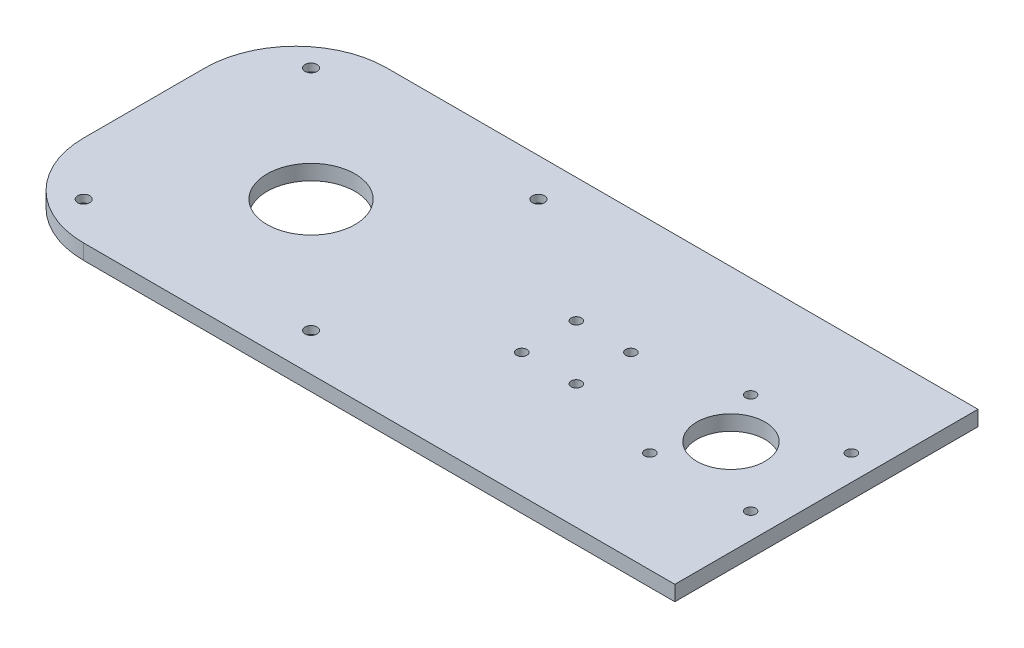
ISO-10303-21;
HEADER;
FILE_DESCRIPTION(('STEP AP214'),'2;1');
FILE_NAME('part.step','',(''),(''),'','','');
FILE_SCHEMA(('AUTOMOTIVE_DESIGN { 1 0 10303 214 1 1 1 1 }'));
ENDSEC;
DATA;
#1=APPLICATION_CONTEXT('core data for automotive mechanical design processes');
#2=APPLICATION_PROTOCOL_DEFINITION('international standard','automotive_design',2000,#1);
#3=PRODUCT_CONTEXT('',#1,'mechanical');
#4=PRODUCT('Part','Part','',(#3));
#5=PRODUCT_RELATED_PRODUCT_CATEGORY('part','',(#4));
#6=PRODUCT_DEFINITION_FORMATION('','',#4);
#7=PRODUCT_DEFINITION_CONTEXT('part definition',#1,'design');
#8=PRODUCT_DEFINITION('design','',#6,#7);
#9=PRODUCT_DEFINITION_SHAPE('','',#8);
#10=(LENGTH_UNIT() NAMED_UNIT(*) SI_UNIT(.MILLI.,.METRE.));
#11=(NAMED_UNIT(*) PLANE_ANGLE_UNIT() SI_UNIT($,.RADIAN.));
#12=(NAMED_UNIT(*) SI_UNIT($,.STERADIAN.) SOLID_ANGLE_UNIT());
#13=UNCERTAINTY_MEASURE_WITH_UNIT(LENGTH_MEASURE(1.E-05),#10,'distance_accuracy_value','');
#14=(GEOMETRIC_REPRESENTATION_CONTEXT(3) GLOBAL_UNCERTAINTY_ASSIGNED_CONTEXT((#13)) GLOBAL_UNIT_ASSIGNED_CONTEXT((#10,
#11,#12)) REPRESENTATION_CONTEXT('',''));
#15=CARTESIAN_POINT('',(0.,0.,0.));
#16=DIRECTION('',(0.,0.,1.));
#17=DIRECTION('',(1.,0.,0.));
#18=AXIS2_PLACEMENT_3D('',#15,#16,#17);
#19=CARTESIAN_POINT('',(-190.,0.,-75.));
#20=DIRECTION('',(0.,1.,0.));
#21=DIRECTION('',(0.,0.,1.));
#22=AXIS2_PLACEMENT_3D('',#19,#20,#21);
#23=CYLINDRICAL_SURFACE('',#22,3.99999999999999);
#24=CARTESIAN_POINT('',(-190.,10.,-75.));
#25=DIRECTION('',(0.,1.,0.));
#26=DIRECTION('',(0.,0.,1.));
#27=AXIS2_PLACEMENT_3D('',#24,#25,#26);
#28=CIRCLE('',#27,3.99999999999999);
#29=CARTESIAN_POINT('',(-190.,10.,-71.));
#30=VERTEX_POINT('',#29);
#31=EDGE_CURVE('E274',#30,#30,#28,.T.);
#32=ORIENTED_EDGE('',*,*,#31,.T.);
#33=EDGE_LOOP('',(#32));
#34=FACE_BOUND('',#33,.T.);
#35=CARTESIAN_POINT('',(-190.,5.,-75.));
#36=DIRECTION('',(0.,-1.,0.));
#37=DIRECTION('',(0.,0.,-1.));
#38=AXIS2_PLACEMENT_3D('',#35,#36,#37);
#39=CIRCLE('',#38,3.99999999999999);
#40=CARTESIAN_POINT('',(-190.,5.,-79.));
#41=VERTEX_POINT('',#40);
#42=EDGE_CURVE('E154',#41,#41,#39,.F.);
#43=ORIENTED_EDGE('',*,*,#42,.F.);
#44=EDGE_LOOP('',(#43));
#45=FACE_BOUND('',#44,.T.);
#46=ADVANCED_FACE('F37',(#34,#45),#23,.F.);
#47=CARTESIAN_POINT('',(-40.,0.,-75.0000000000001));
#48=DIRECTION('',(0.,1.,0.));
#49=DIRECTION('',(0.,0.,1.));
#50=AXIS2_PLACEMENT_3D('',#47,#48,#49);
#51=CYLINDRICAL_SURFACE('',#50,4.00000000000001);
#52=CARTESIAN_POINT('',(-40.,10.,-75.0000000000001));
#53=DIRECTION('',(0.,1.,0.));
#54=DIRECTION('',(0.,0.,-1.));
#55=AXIS2_PLACEMENT_3D('',#52,#53,#54);
#56=CIRCLE('',#55,4.00000000000001);
#57=CARTESIAN_POINT('',(-40.,10.,-79.0000000000001));
#58=VERTEX_POINT('',#57);
#59=EDGE_CURVE('E283',#58,#58,#56,.T.);
#60=ORIENTED_EDGE('',*,*,#59,.T.);
#61=EDGE_LOOP('',(#60));
#62=FACE_BOUND('',#61,.T.);
#63=CARTESIAN_POINT('',(-40.,5.,-75.0000000000001));
#64=DIRECTION('',(0.,-1.,0.));
#65=DIRECTION('',(0.,0.,-1.));
#66=AXIS2_PLACEMENT_3D('',#63,#64,#65);
#67=CIRCLE('',#66,4.00000000000001);
#68=CARTESIAN_POINT('',(-40.,5.,-79.0000000000001));
#69=VERTEX_POINT('',#68);
#70=EDGE_CURVE('E150',#69,#69,#67,.F.);
#71=ORIENTED_EDGE('',*,*,#70,.F.);
#72=EDGE_LOOP('',(#71));
#73=FACE_BOUND('',#72,.T.);
#74=ADVANCED_FACE('F201',(#62,#73),#51,.F.);
#75=CARTESIAN_POINT('',(-39.9999999999999,0.,75.));
#76=DIRECTION('',(0.,1.,0.));
#77=DIRECTION('',(0.,0.,1.));
#78=AXIS2_PLACEMENT_3D('',#75,#76,#77);
#79=CYLINDRICAL_SURFACE('',#78,4.00000000000001);
#80=CARTESIAN_POINT('',(-39.9999999999999,10.,75.));
#81=DIRECTION('',(0.,1.,0.));
#82=DIRECTION('',(0.,0.,1.));
#83=AXIS2_PLACEMENT_3D('',#80,#81,#82);
#84=CIRCLE('',#83,4.00000000000001);
#85=CARTESIAN_POINT('',(-39.9999999999999,10.,79.));
#86=VERTEX_POINT('',#85);
#87=EDGE_CURVE('E280',#86,#86,#84,.T.);
#88=ORIENTED_EDGE('',*,*,#87,.T.);
#89=EDGE_LOOP('',(#88));
#90=FACE_BOUND('',#89,.T.);
#91=CARTESIAN_POINT('',(-39.9999999999999,5.,75.));
#92=DIRECTION('',(0.,-1.,0.));
#93=DIRECTION('',(0.,0.,-1.));
#94=AXIS2_PLACEMENT_3D('',#91,#92,#93);
#95=CIRCLE('',#94,4.00000000000001);
#96=CARTESIAN_POINT('',(-39.9999999999999,5.,71.));
#97=VERTEX_POINT('',#96);
#98=EDGE_CURVE('E147',#97,#97,#95,.F.);
#99=ORIENTED_EDGE('',*,*,#98,.F.);
#100=EDGE_LOOP('',(#99));
#101=FACE_BOUND('',#100,.T.);
#102=ADVANCED_FACE('F207',(#90,#101),#79,.F.);
#103=CARTESIAN_POINT('',(-190.,0.,75.));
#104=DIRECTION('',(0.,1.,0.));
#105=DIRECTION('',(0.,0.,1.));
#106=AXIS2_PLACEMENT_3D('',#103,#104,#105);
#107=CYLINDRICAL_SURFACE('',#106,3.99999999999999);
#108=CARTESIAN_POINT('',(-190.,10.,75.));
#109=DIRECTION('',(0.,1.,0.));
#110=DIRECTION('',(0.,0.,-1.));
#111=AXIS2_PLACEMENT_3D('',#108,#109,#110);
#112=CIRCLE('',#111,3.99999999999999);
#113=CARTESIAN_POINT('',(-190.,10.,71.));
#114=VERTEX_POINT('',#113);
#115=EDGE_CURVE('E277',#114,#114,#112,.T.);
#116=ORIENTED_EDGE('',*,*,#115,.T.);
#117=EDGE_LOOP('',(#116));
#118=FACE_BOUND('',#117,.T.);
#119=CARTESIAN_POINT('',(-190.,5.,75.));
#120=DIRECTION('',(0.,-1.,0.));
#121=DIRECTION('',(0.,0.,-1.));
#122=AXIS2_PLACEMENT_3D('',#119,#120,#121);
#123=CIRCLE('',#122,3.99999999999999);
#124=CARTESIAN_POINT('',(-190.,5.,71.));
#125=VERTEX_POINT('',#124);
#126=EDGE_CURVE('E142',#125,#125,#123,.F.);
#127=ORIENTED_EDGE('',*,*,#126,.F.);
#128=EDGE_LOOP('',(#127));
#129=FACE_BOUND('',#128,.T.);
#130=ADVANCED_FACE('F218',(#118,#129),#107,.F.);
#131=CARTESIAN_POINT('',(-225.,10.,100.));
#132=DIRECTION('',(1.,0.,0.));
#133=DIRECTION('',(0.,0.,-1.));
#134=AXIS2_PLACEMENT_3D('',#131,#132,#133);
#135=PLANE('',#134);
#136=DIRECTION('',(0.,0.,1.));
#137=VECTOR('',#136,1.);
#138=CARTESIAN_POINT('',(-225.,0.,100.));
#139=LINE('',#138,#137);
#140=CARTESIAN_POINT('',(-225.,0.,-40.));
#141=VERTEX_POINT('',#140);
#142=CARTESIAN_POINT('',(-225.,0.,40.));
#143=VERTEX_POINT('',#142);
#144=EDGE_CURVE('E120',#141,#143,#139,.T.);
#145=ORIENTED_EDGE('',*,*,#144,.T.);
#146=DIRECTION('',(0.,-1.,0.));
#147=VECTOR('',#146,1.);
#148=CARTESIAN_POINT('',(-225.,10.,40.));
#149=LINE('',#148,#147);
#150=CARTESIAN_POINT('',(-225.,10.,40.));
#151=VERTEX_POINT('',#150);
#152=EDGE_CURVE('E58',#143,#151,#149,.F.);
#153=ORIENTED_EDGE('',*,*,#152,.T.);
#154=DIRECTION('',(0.,0.,1.));
#155=VECTOR('',#154,1.);
#156=CARTESIAN_POINT('',(-225.,10.,100.));
#157=LINE('',#156,#155);
#158=CARTESIAN_POINT('',(-225.,10.,-40.));
#159=VERTEX_POINT('',#158);
#160=EDGE_CURVE('E101',#159,#151,#157,.T.);
#161=ORIENTED_EDGE('',*,*,#160,.F.);
#162=DIRECTION('',(0.,-1.,0.));
#163=VECTOR('',#162,1.);
#164=CARTESIAN_POINT('',(-225.,10.,-40.));
#165=LINE('',#164,#163);
#166=EDGE_CURVE('E176',#159,#141,#165,.T.);
#167=ORIENTED_EDGE('',*,*,#166,.T.);
#168=EDGE_LOOP('',(#145,#153,#161,#167));
#169=FACE_BOUND('',#168,.T.);
#170=ADVANCED_FACE('F184',(#169),#135,.F.);
#171=CARTESIAN_POINT('',(225.,10.,100.));
#172=DIRECTION('',(0.,0.,-1.));
#173=DIRECTION('',(-1.,0.,0.));
#174=AXIS2_PLACEMENT_3D('',#171,#172,#173);
#175=PLANE('',#174);
#176=DIRECTION('',(1.,0.,0.));
#177=VECTOR('',#176,1.);
#178=CARTESIAN_POINT('',(225.,10.,100.));
#179=LINE('',#178,#177);
#180=CARTESIAN_POINT('',(-165.,10.,100.));
#181=VERTEX_POINT('',#180);
#182=CARTESIAN_POINT('',(225.,10.,100.));
#183=VERTEX_POINT('',#182);
#184=EDGE_CURVE('E91',#181,#183,#179,.T.);
#185=ORIENTED_EDGE('',*,*,#184,.F.);
#186=DIRECTION('',(0.,-1.,0.));
#187=VECTOR('',#186,1.);
#188=CARTESIAN_POINT('',(-165.,10.,100.));
#189=LINE('',#188,#187);
#190=CARTESIAN_POINT('',(-165.,0.,100.));
#191=VERTEX_POINT('',#190);
#192=EDGE_CURVE('E110',#181,#191,#189,.T.);
#193=ORIENTED_EDGE('',*,*,#192,.T.);
#194=DIRECTION('',(1.,0.,0.));
#195=VECTOR('',#194,1.);
#196=CARTESIAN_POINT('',(225.,0.,100.));
#197=LINE('',#196,#195);
#198=CARTESIAN_POINT('',(225.,0.,100.));
#199=VERTEX_POINT('',#198);
#200=EDGE_CURVE('E107',#191,#199,#197,.T.);
#201=ORIENTED_EDGE('',*,*,#200,.T.);
#202=DIRECTION('',(0.,-1.,0.));
#203=VECTOR('',#202,1.);
#204=CARTESIAN_POINT('',(225.,10.,100.));
#205=LINE('',#204,#203);
#206=EDGE_CURVE('E104',#183,#199,#205,.T.);
#207=ORIENTED_EDGE('',*,*,#206,.F.);
#208=EDGE_LOOP('',(#185,#193,#201,#207));
#209=FACE_BOUND('',#208,.T.);
#210=ADVANCED_FACE('F105',(#209),#175,.F.);
#211=CARTESIAN_POINT('',(225.,10.,100.));
#212=DIRECTION('',(-1.,0.,0.));
#213=DIRECTION('',(0.,0.,1.));
#214=AXIS2_PLACEMENT_3D('',#211,#212,#213);
#215=PLANE('',#214);
#216=DIRECTION('',(0.,0.,-1.));
#217=VECTOR('',#216,1.);
#218=CARTESIAN_POINT('',(225.,0.,100.));
#219=LINE('',#218,#217);
#220=CARTESIAN_POINT('',(225.,0.,-100.));
#221=VERTEX_POINT('',#220);
#222=EDGE_CURVE('E124',#199,#221,#219,.T.);
#223=ORIENTED_EDGE('',*,*,#222,.T.);
#224=DIRECTION('',(0.,-1.,0.));
#225=VECTOR('',#224,1.);
#226=CARTESIAN_POINT('',(225.,10.,-100.));
#227=LINE('',#226,#225);
#228=CARTESIAN_POINT('',(225.,10.,-100.));
#229=VERTEX_POINT('',#228);
#230=EDGE_CURVE('E111',#229,#221,#227,.T.);
#231=ORIENTED_EDGE('',*,*,#230,.F.);
#232=DIRECTION('',(0.,0.,-1.));
#233=VECTOR('',#232,1.);
#234=CARTESIAN_POINT('',(225.,10.,100.));
#235=LINE('',#234,#233);
#236=EDGE_CURVE('E95',#183,#229,#235,.T.);
#237=ORIENTED_EDGE('',*,*,#236,.F.);
#238=ORIENTED_EDGE('',*,*,#206,.T.);
#239=EDGE_LOOP('',(#223,#231,#237,#238));
#240=FACE_BOUND('',#239,.T.);
#241=ADVANCED_FACE('F113',(#240),#215,.F.);
#242=CARTESIAN_POINT('',(225.,10.,-100.));
#243=DIRECTION('',(0.,0.,1.));
#244=DIRECTION('',(1.,0.,0.));
#245=AXIS2_PLACEMENT_3D('',#242,#243,#244);
#246=PLANE('',#245);
#247=DIRECTION('',(-1.,0.,0.));
#248=VECTOR('',#247,1.);
#249=CARTESIAN_POINT('',(225.,0.,-100.));
#250=LINE('',#249,#248);
#251=CARTESIAN_POINT('',(-165.,0.,-100.));
#252=VERTEX_POINT('',#251);
#253=EDGE_CURVE('E126',#221,#252,#250,.T.);
#254=ORIENTED_EDGE('',*,*,#253,.T.);
#255=DIRECTION('',(0.,-1.,0.));
#256=VECTOR('',#255,1.);
#257=CARTESIAN_POINT('',(-165.,10.,-100.));
#258=LINE('',#257,#256);
#259=CARTESIAN_POINT('',(-165.,10.,-100.));
#260=VERTEX_POINT('',#259);
#261=EDGE_CURVE('E11',#252,#260,#258,.F.);
#262=ORIENTED_EDGE('',*,*,#261,.T.);
#263=DIRECTION('',(-1.,0.,0.));
#264=VECTOR('',#263,1.);
#265=CARTESIAN_POINT('',(225.,10.,-100.));
#266=LINE('',#265,#264);
#267=EDGE_CURVE('E115',#229,#260,#266,.T.);
#268=ORIENTED_EDGE('',*,*,#267,.F.);
#269=ORIENTED_EDGE('',*,*,#230,.T.);
#270=EDGE_LOOP('',(#254,#262,#268,#269));
#271=FACE_BOUND('',#270,.T.);
#272=ADVANCED_FACE('F189',(#271),#246,.F.);
#273=CARTESIAN_POINT('',(0.,10.,0.));
#274=DIRECTION('',(0.,1.,0.));
#275=DIRECTION('',(0.,0.,1.));
#276=AXIS2_PLACEMENT_3D('',#273,#274,#275);
#277=PLANE('',#276);
#278=CARTESIAN_POINT('',(42.,10.,-18.));
#279=DIRECTION('',(0.,1.,0.));
#280=DIRECTION('',(0.,0.,1.));
#281=AXIS2_PLACEMENT_3D('',#278,#279,#280);
#282=CIRCLE('',#281,3.39999999999999);
#283=CARTESIAN_POINT('',(42.,10.,-14.6));
#284=VERTEX_POINT('',#283);
#285=EDGE_CURVE('E170',#284,#284,#282,.T.);
#286=ORIENTED_EDGE('',*,*,#285,.F.);
#287=EDGE_LOOP('',(#286));
#288=FACE_BOUND('',#287,.T.);
#289=CARTESIAN_POINT('',(78.,10.,-18.));
#290=DIRECTION('',(0.,1.,0.));
#291=DIRECTION('',(0.,0.,1.));
#292=AXIS2_PLACEMENT_3D('',#289,#290,#291);
#293=CIRCLE('',#292,3.39999999999999);
#294=CARTESIAN_POINT('',(78.,10.,-14.6));
#295=VERTEX_POINT('',#294);
#296=EDGE_CURVE('E166',#295,#295,#293,.T.);
#297=ORIENTED_EDGE('',*,*,#296,.F.);
#298=EDGE_LOOP('',(#297));
#299=FACE_BOUND('',#298,.T.);
#300=CARTESIAN_POINT('',(42.,10.,18.));
#301=DIRECTION('',(0.,1.,0.));
#302=DIRECTION('',(0.,0.,1.));
#303=AXIS2_PLACEMENT_3D('',#300,#301,#302);
#304=CIRCLE('',#303,3.39999999999999);
#305=CARTESIAN_POINT('',(42.,10.,21.4));
#306=VERTEX_POINT('',#305);
#307=EDGE_CURVE('E162',#306,#306,#304,.T.);
#308=ORIENTED_EDGE('',*,*,#307,.F.);
#309=EDGE_LOOP('',(#308));
#310=FACE_BOUND('',#309,.T.);
#311=CARTESIAN_POINT('',(78.,10.,18.));
#312=DIRECTION('',(0.,1.,0.));
#313=DIRECTION('',(0.,0.,1.));
#314=AXIS2_PLACEMENT_3D('',#311,#312,#313);
#315=CIRCLE('',#314,3.39999999999999);
#316=CARTESIAN_POINT('',(78.,10.,21.4));
#317=VERTEX_POINT('',#316);
#318=EDGE_CURVE('E161',#317,#317,#315,.T.);
#319=ORIENTED_EDGE('',*,*,#318,.F.);
#320=EDGE_LOOP('',(#319));
#321=FACE_BOUND('',#320,.T.);
#322=CARTESIAN_POINT('',(162.,10.,0.));
#323=DIRECTION('',(0.,1.,0.));
#324=DIRECTION('',(0.,0.,1.));
#325=AXIS2_PLACEMENT_3D('',#322,#323,#324);
#326=CIRCLE('',#325,22.5);
#327=CARTESIAN_POINT('',(162.,10.,22.5));
#328=VERTEX_POINT('',#327);
#329=EDGE_CURVE('E145',#328,#328,#326,.T.);
#330=ORIENTED_EDGE('',*,*,#329,.F.);
#331=EDGE_LOOP('',(#330));
#332=FACE_BOUND('',#331,.T.);
#333=CARTESIAN_POINT('',(141.765981284232,10.,-33.2340187157678));
#334=DIRECTION('',(0.,1.,0.));
#335=DIRECTION('',(0.,0.,1.));
#336=AXIS2_PLACEMENT_3D('',#333,#334,#335);
#337=CIRCLE('',#336,3.39999999999999);
#338=CARTESIAN_POINT('',(141.765981284232,10.,-29.8340187157678));
#339=VERTEX_POINT('',#338);
#340=EDGE_CURVE('E141',#339,#339,#337,.T.);
#341=ORIENTED_EDGE('',*,*,#340,.F.);
#342=EDGE_LOOP('',(#341));
#343=FACE_BOUND('',#342,.T.);
#344=CARTESIAN_POINT('',(208.234018715768,10.,-33.2340187157678));
#345=DIRECTION('',(0.,1.,0.));
#346=DIRECTION('',(0.,0.,1.));
#347=AXIS2_PLACEMENT_3D('',#344,#345,#346);
#348=CIRCLE('',#347,3.39999999999999);
#349=CARTESIAN_POINT('',(208.234018715768,10.,-29.8340187157678));
#350=VERTEX_POINT('',#349);
#351=EDGE_CURVE('E137',#350,#350,#348,.T.);
#352=ORIENTED_EDGE('',*,*,#351,.F.);
#353=EDGE_LOOP('',(#352));
#354=FACE_BOUND('',#353,.T.);
#355=CARTESIAN_POINT('',(141.765981284232,10.,33.2340187157678));
#356=DIRECTION('',(0.,1.,0.));
#357=DIRECTION('',(0.,0.,1.));
#358=AXIS2_PLACEMENT_3D('',#355,#356,#357);
#359=CIRCLE('',#358,3.39999999999999);
#360=CARTESIAN_POINT('',(141.765981284232,10.,36.6340187157678));
#361=VERTEX_POINT('',#360);
#362=EDGE_CURVE('E133',#361,#361,#359,.T.);
#363=ORIENTED_EDGE('',*,*,#362,.F.);
#364=EDGE_LOOP('',(#363));
#365=FACE_BOUND('',#364,.T.);
#366=CARTESIAN_POINT('',(208.234018715768,10.,33.2340187157678));
#367=DIRECTION('',(0.,1.,0.));
#368=DIRECTION('',(0.,0.,1.));
#369=AXIS2_PLACEMENT_3D('',#366,#367,#368);
#370=CIRCLE('',#369,3.39999999999999);
#371=CARTESIAN_POINT('',(208.234018715768,10.,36.6340187157677));
#372=VERTEX_POINT('',#371);
#373=EDGE_CURVE('E132',#372,#372,#370,.T.);
#374=ORIENTED_EDGE('',*,*,#373,.F.);
#375=EDGE_LOOP('',(#374));
#376=FACE_BOUND('',#375,.T.);
#377=ORIENTED_EDGE('',*,*,#115,.F.);
#378=EDGE_LOOP('',(#377));
#379=FACE_BOUND('',#378,.T.);
#380=ORIENTED_EDGE('',*,*,#87,.F.);
#381=EDGE_LOOP('',(#380));
#382=FACE_BOUND('',#381,.T.);
#383=ORIENTED_EDGE('',*,*,#59,.F.);
#384=EDGE_LOOP('',(#383));
#385=FACE_BOUND('',#384,.T.);
#386=ORIENTED_EDGE('',*,*,#31,.F.);
#387=EDGE_LOOP('',(#386));
#388=FACE_BOUND('',#387,.T.);
#389=CARTESIAN_POINT('',(-115.,10.,0.));
#390=DIRECTION('',(0.,1.,0.));
#391=DIRECTION('',(0.,0.,1.));
#392=AXIS2_PLACEMENT_3D('',#389,#390,#391);
#393=CIRCLE('',#392,29.);
#394=CARTESIAN_POINT('',(-115.,10.,28.9999999999999));
#395=VERTEX_POINT('',#394);
#396=EDGE_CURVE('E271',#395,#395,#393,.T.);
#397=ORIENTED_EDGE('',*,*,#396,.F.);
#398=EDGE_LOOP('',(#397));
#399=FACE_BOUND('',#398,.T.);
#400=ORIENTED_EDGE('',*,*,#160,.T.);
#401=CARTESIAN_POINT('',(-165.,10.,40.));
#402=DIRECTION('',(0.,1.,0.));
#403=DIRECTION('',(0.,0.,1.));
#404=AXIS2_PLACEMENT_3D('',#401,#402,#403);
#405=CIRCLE('',#404,60.);
#406=EDGE_CURVE('E45',#151,#181,#405,.T.);
#407=ORIENTED_EDGE('',*,*,#406,.T.);
#408=ORIENTED_EDGE('',*,*,#184,.T.);
#409=ORIENTED_EDGE('',*,*,#236,.T.);
#410=ORIENTED_EDGE('',*,*,#267,.T.);
#411=CARTESIAN_POINT('',(-165.,10.,-40.));
#412=DIRECTION('',(0.,1.,0.));
#413=DIRECTION('',(0.,0.,1.));
#414=AXIS2_PLACEMENT_3D('',#411,#412,#413);
#415=CIRCLE('',#414,60.);
#416=EDGE_CURVE('E180',#260,#159,#415,.T.);
#417=ORIENTED_EDGE('',*,*,#416,.T.);
#418=EDGE_LOOP('',(#400,#407,#408,#409,#410,#417));
#419=FACE_BOUND('',#418,.T.);
#420=ADVANCED_FACE('F93',(#288,#299,#310,#321,#332,#343,#354,#365,#376,#379,#382,#385,#388,#399,
#419),#277,.T.);
#421=CARTESIAN_POINT('',(0.,0.,0.));
#422=DIRECTION('',(0.,1.,0.));
#423=DIRECTION('',(0.,0.,1.));
#424=AXIS2_PLACEMENT_3D('',#421,#422,#423);
#425=PLANE('',#424);
#426=CARTESIAN_POINT('',(42.,0.,-18.));
#427=DIRECTION('',(0.,1.,0.));
#428=DIRECTION('',(0.,0.,1.));
#429=AXIS2_PLACEMENT_3D('',#426,#427,#428);
#430=CIRCLE('',#429,3.39999999999999);
#431=CARTESIAN_POINT('',(42.,0.,-14.6));
#432=VERTEX_POINT('',#431);
#433=EDGE_CURVE('E167',#432,#432,#430,.T.);
#434=ORIENTED_EDGE('',*,*,#433,.T.);
#435=EDGE_LOOP('',(#434));
#436=FACE_BOUND('',#435,.T.);
#437=CARTESIAN_POINT('',(78.,0.,-18.));
#438=DIRECTION('',(0.,1.,0.));
#439=DIRECTION('',(0.,0.,1.));
#440=AXIS2_PLACEMENT_3D('',#437,#438,#439);
#441=CIRCLE('',#440,3.39999999999999);
#442=CARTESIAN_POINT('',(78.,0.,-14.6));
#443=VERTEX_POINT('',#442);
#444=EDGE_CURVE('E163',#443,#443,#441,.T.);
#445=ORIENTED_EDGE('',*,*,#444,.T.);
#446=EDGE_LOOP('',(#445));
#447=FACE_BOUND('',#446,.T.);
#448=CARTESIAN_POINT('',(42.,0.,18.));
#449=DIRECTION('',(0.,1.,0.));
#450=DIRECTION('',(0.,0.,1.));
#451=AXIS2_PLACEMENT_3D('',#448,#449,#450);
#452=CIRCLE('',#451,3.39999999999999);
#453=CARTESIAN_POINT('',(42.,0.,21.4));
#454=VERTEX_POINT('',#453);
#455=EDGE_CURVE('E158',#454,#454,#452,.T.);
#456=ORIENTED_EDGE('',*,*,#455,.T.);
#457=EDGE_LOOP('',(#456));
#458=FACE_BOUND('',#457,.T.);
#459=CARTESIAN_POINT('',(78.,0.,18.));
#460=DIRECTION('',(0.,1.,0.));
#461=DIRECTION('',(0.,0.,1.));
#462=AXIS2_PLACEMENT_3D('',#459,#460,#461);
#463=CIRCLE('',#462,3.39999999999999);
#464=CARTESIAN_POINT('',(78.,0.,21.4));
#465=VERTEX_POINT('',#464);
#466=EDGE_CURVE('E239',#465,#465,#463,.T.);
#467=ORIENTED_EDGE('',*,*,#466,.T.);
#468=EDGE_LOOP('',(#467));
#469=FACE_BOUND('',#468,.T.);
#470=CARTESIAN_POINT('',(-190.,0.,-75.));
#471=DIRECTION('',(0.,-1.,0.));
#472=DIRECTION('',(0.,0.,-1.));
#473=AXIS2_PLACEMENT_3D('',#470,#471,#472);
#474=CIRCLE('',#473,8.99999999999998);
#475=CARTESIAN_POINT('',(-190.,0.,-84.));
#476=VERTEX_POINT('',#475);
#477=EDGE_CURVE('E243',#476,#476,#474,.T.);
#478=ORIENTED_EDGE('',*,*,#477,.F.);
#479=EDGE_LOOP('',(#478));
#480=FACE_BOUND('',#479,.T.);
#481=CARTESIAN_POINT('',(-40.,0.,75.));
#482=DIRECTION('',(0.,-1.,0.));
#483=DIRECTION('',(0.,0.,-1.));
#484=AXIS2_PLACEMENT_3D('',#481,#482,#483);
#485=CIRCLE('',#484,8.99999999999998);
#486=CARTESIAN_POINT('',(-40.,0.,66.));
#487=VERTEX_POINT('',#486);
#488=EDGE_CURVE('E247',#487,#487,#485,.T.);
#489=ORIENTED_EDGE('',*,*,#488,.F.);
#490=EDGE_LOOP('',(#489));
#491=FACE_BOUND('',#490,.T.);
#492=CARTESIAN_POINT('',(-40.,0.,-75.));
#493=DIRECTION('',(0.,-1.,0.));
#494=DIRECTION('',(0.,0.,-1.));
#495=AXIS2_PLACEMENT_3D('',#492,#493,#494);
#496=CIRCLE('',#495,8.99999999999998);
#497=CARTESIAN_POINT('',(-40.,0.,-84.));
#498=VERTEX_POINT('',#497);
#499=EDGE_CURVE('E251',#498,#498,#496,.T.);
#500=ORIENTED_EDGE('',*,*,#499,.F.);
#501=EDGE_LOOP('',(#500));
#502=FACE_BOUND('',#501,.T.);
#503=CARTESIAN_POINT('',(-190.,0.,75.));
#504=DIRECTION('',(0.,-1.,0.));
#505=DIRECTION('',(0.,0.,-1.));
#506=AXIS2_PLACEMENT_3D('',#503,#504,#505);
#507=CIRCLE('',#506,8.99999999999998);
#508=CARTESIAN_POINT('',(-190.,0.,66.));
#509=VERTEX_POINT('',#508);
#510=EDGE_CURVE('E157',#509,#509,#507,.T.);
#511=ORIENTED_EDGE('',*,*,#510,.F.);
#512=EDGE_LOOP('',(#511));
#513=FACE_BOUND('',#512,.T.);
#514=CARTESIAN_POINT('',(162.,0.,0.));
#515=DIRECTION('',(0.,1.,0.));
#516=DIRECTION('',(0.,0.,1.));
#517=AXIS2_PLACEMENT_3D('',#514,#515,#516);
#518=CIRCLE('',#517,22.5);
#519=CARTESIAN_POINT('',(162.,0.,22.5));
#520=VERTEX_POINT('',#519);
#521=EDGE_CURVE('E258',#520,#520,#518,.T.);
#522=ORIENTED_EDGE('',*,*,#521,.T.);
#523=EDGE_LOOP('',(#522));
#524=FACE_BOUND('',#523,.T.);
#525=CARTESIAN_POINT('',(141.765981284232,0.,-33.2340187157678));
#526=DIRECTION('',(0.,1.,0.));
#527=DIRECTION('',(0.,0.,1.));
#528=AXIS2_PLACEMENT_3D('',#525,#526,#527);
#529=CIRCLE('',#528,3.39999999999999);
#530=CARTESIAN_POINT('',(141.765981284232,0.,-29.8340187157678));
#531=VERTEX_POINT('',#530);
#532=EDGE_CURVE('E138',#531,#531,#529,.T.);
#533=ORIENTED_EDGE('',*,*,#532,.T.);
#534=EDGE_LOOP('',(#533));
#535=FACE_BOUND('',#534,.T.);
#536=CARTESIAN_POINT('',(208.234018715768,0.,-33.2340187157678));
#537=DIRECTION('',(0.,1.,0.));
#538=DIRECTION('',(0.,0.,1.));
#539=AXIS2_PLACEMENT_3D('',#536,#537,#538);
#540=CIRCLE('',#539,3.39999999999999);
#541=CARTESIAN_POINT('',(208.234018715768,0.,-29.8340187157678));
#542=VERTEX_POINT('',#541);
#543=EDGE_CURVE('E134',#542,#542,#540,.T.);
#544=ORIENTED_EDGE('',*,*,#543,.T.);
#545=EDGE_LOOP('',(#544));
#546=FACE_BOUND('',#545,.T.);
#547=CARTESIAN_POINT('',(141.765981284232,0.,33.2340187157678));
#548=DIRECTION('',(0.,1.,0.));
#549=DIRECTION('',(0.,0.,1.));
#550=AXIS2_PLACEMENT_3D('',#547,#548,#549);
#551=CIRCLE('',#550,3.39999999999999);
#552=CARTESIAN_POINT('',(141.765981284232,0.,36.6340187157678));
#553=VERTEX_POINT('',#552);
#554=EDGE_CURVE('E129',#553,#553,#551,.T.);
#555=ORIENTED_EDGE('',*,*,#554,.T.);
#556=EDGE_LOOP('',(#555));
#557=FACE_BOUND('',#556,.T.);
#558=CARTESIAN_POINT('',(208.234018715768,0.,33.2340187157678));
#559=DIRECTION('',(0.,1.,0.));
#560=DIRECTION('',(0.,0.,1.));
#561=AXIS2_PLACEMENT_3D('',#558,#559,#560);
#562=CIRCLE('',#561,3.39999999999999);
#563=CARTESIAN_POINT('',(208.234018715768,0.,36.6340187157677));
#564=VERTEX_POINT('',#563);
#565=EDGE_CURVE('E268',#564,#564,#562,.T.);
#566=ORIENTED_EDGE('',*,*,#565,.T.);
#567=EDGE_LOOP('',(#566));
#568=FACE_BOUND('',#567,.T.);
#569=CARTESIAN_POINT('',(-115.,0.,0.));
#570=DIRECTION('',(0.,1.,0.));
#571=DIRECTION('',(0.,0.,1.));
#572=AXIS2_PLACEMENT_3D('',#569,#570,#571);
#573=CIRCLE('',#572,29.);
#574=CARTESIAN_POINT('',(-115.,0.,28.9999999999999));
#575=VERTEX_POINT('',#574);
#576=EDGE_CURVE('E122',#575,#575,#573,.T.);
#577=ORIENTED_EDGE('',*,*,#576,.T.);
#578=EDGE_LOOP('',(#577));
#579=FACE_BOUND('',#578,.T.);
#580=ORIENTED_EDGE('',*,*,#200,.F.);
#581=CARTESIAN_POINT('',(-165.,0.,40.));
#582=DIRECTION('',(0.,1.,0.));
#583=DIRECTION('',(0.,0.,1.));
#584=AXIS2_PLACEMENT_3D('',#581,#582,#583);
#585=CIRCLE('',#584,60.);
#586=EDGE_CURVE('E174',#191,#143,#585,.F.);
#587=ORIENTED_EDGE('',*,*,#586,.T.);
#588=ORIENTED_EDGE('',*,*,#144,.F.);
#589=CARTESIAN_POINT('',(-165.,0.,-40.));
#590=DIRECTION('',(0.,1.,0.));
#591=DIRECTION('',(0.,0.,1.));
#592=AXIS2_PLACEMENT_3D('',#589,#590,#591);
#593=CIRCLE('',#592,60.);
#594=EDGE_CURVE('E172',#141,#252,#593,.F.);
#595=ORIENTED_EDGE('',*,*,#594,.T.);
#596=ORIENTED_EDGE('',*,*,#253,.F.);
#597=ORIENTED_EDGE('',*,*,#222,.F.);
#598=EDGE_LOOP('',(#580,#587,#588,#595,#596,#597));
#599=FACE_BOUND('',#598,.T.);
#600=ADVANCED_FACE('F188',(#436,#447,#458,#469,#480,#491,#502,#513,#524,#535,#546,#557,#568,
#579,#599),#425,.F.);
#601=CARTESIAN_POINT('',(-115.,0.,0.));
#602=DIRECTION('',(0.,1.,0.));
#603=DIRECTION('',(0.,0.,1.));
#604=AXIS2_PLACEMENT_3D('',#601,#602,#603);
#605=CYLINDRICAL_SURFACE('',#604,29.);
#606=ORIENTED_EDGE('',*,*,#576,.F.);
#607=EDGE_LOOP('',(#606));
#608=FACE_BOUND('',#607,.T.);
#609=ORIENTED_EDGE('',*,*,#396,.T.);
#610=EDGE_LOOP('',(#609));
#611=FACE_BOUND('',#610,.T.);
#612=ADVANCED_FACE('F223',(#608,#611),#605,.F.);
#613=CARTESIAN_POINT('',(208.234018715768,10.,33.2340187157678));
#614=DIRECTION('',(0.,1.,0.));
#615=DIRECTION('',(0.,0.,1.));
#616=AXIS2_PLACEMENT_3D('',#613,#614,#615);
#617=CYLINDRICAL_SURFACE('',#616,3.39999999999999);
#618=ORIENTED_EDGE('',*,*,#373,.T.);
#619=EDGE_LOOP('',(#618));
#620=FACE_BOUND('',#619,.T.);
#621=ORIENTED_EDGE('',*,*,#565,.F.);
#622=EDGE_LOOP('',(#621));
#623=FACE_BOUND('',#622,.T.);
#624=ADVANCED_FACE('F213',(#620,#623),#617,.F.);
#625=CARTESIAN_POINT('',(141.765981284232,10.,33.2340187157678));
#626=DIRECTION('',(0.,1.,0.));
#627=DIRECTION('',(0.,0.,1.));
#628=AXIS2_PLACEMENT_3D('',#625,#626,#627);
#629=CYLINDRICAL_SURFACE('',#628,3.39999999999999);
#630=ORIENTED_EDGE('',*,*,#362,.T.);
#631=EDGE_LOOP('',(#630));
#632=FACE_BOUND('',#631,.T.);
#633=ORIENTED_EDGE('',*,*,#554,.F.);
#634=EDGE_LOOP('',(#633));
#635=FACE_BOUND('',#634,.T.);
#636=ADVANCED_FACE('F391',(#632,#635),#629,.F.);
#637=CARTESIAN_POINT('',(208.234018715768,10.,-33.2340187157678));
#638=DIRECTION('',(0.,1.,0.));
#639=DIRECTION('',(0.,0.,1.));
#640=AXIS2_PLACEMENT_3D('',#637,#638,#639);
#641=CYLINDRICAL_SURFACE('',#640,3.39999999999999);
#642=ORIENTED_EDGE('',*,*,#351,.T.);
#643=EDGE_LOOP('',(#642));
#644=FACE_BOUND('',#643,.T.);
#645=ORIENTED_EDGE('',*,*,#543,.F.);
#646=EDGE_LOOP('',(#645));
#647=FACE_BOUND('',#646,.T.);
#648=ADVANCED_FACE('F388',(#644,#647),#641,.F.);
#649=CARTESIAN_POINT('',(141.765981284232,10.,-33.2340187157678));
#650=DIRECTION('',(0.,1.,0.));
#651=DIRECTION('',(0.,0.,1.));
#652=AXIS2_PLACEMENT_3D('',#649,#650,#651);
#653=CYLINDRICAL_SURFACE('',#652,3.39999999999999);
#654=ORIENTED_EDGE('',*,*,#340,.T.);
#655=EDGE_LOOP('',(#654));
#656=FACE_BOUND('',#655,.T.);
#657=ORIENTED_EDGE('',*,*,#532,.F.);
#658=EDGE_LOOP('',(#657));
#659=FACE_BOUND('',#658,.T.);
#660=ADVANCED_FACE('F384',(#656,#659),#653,.F.);
#661=CARTESIAN_POINT('',(162.,0.,0.));
#662=DIRECTION('',(0.,1.,0.));
#663=DIRECTION('',(0.,0.,1.));
#664=AXIS2_PLACEMENT_3D('',#661,#662,#663);
#665=CYLINDRICAL_SURFACE('',#664,22.5);
#666=ORIENTED_EDGE('',*,*,#521,.F.);
#667=EDGE_LOOP('',(#666));
#668=FACE_BOUND('',#667,.T.);
#669=ORIENTED_EDGE('',*,*,#329,.T.);
#670=EDGE_LOOP('',(#669));
#671=FACE_BOUND('',#670,.T.);
#672=ADVANCED_FACE('F377',(#668,#671),#665,.F.);
#673=CARTESIAN_POINT('',(-190.,5.,75.));
#674=DIRECTION('',(0.,-1.,0.));
#675=DIRECTION('',(0.,0.,-1.));
#676=AXIS2_PLACEMENT_3D('',#673,#674,#675);
#677=PLANE('',#676);
#678=CARTESIAN_POINT('',(-190.,5.,75.));
#679=DIRECTION('',(0.,-1.,0.));
#680=DIRECTION('',(0.,0.,-1.));
#681=AXIS2_PLACEMENT_3D('',#678,#679,#680);
#682=CIRCLE('',#681,8.99999999999998);
#683=CARTESIAN_POINT('',(-190.,5.,66.));
#684=VERTEX_POINT('',#683);
#685=EDGE_CURVE('E146',#684,#684,#682,.T.);
#686=ORIENTED_EDGE('',*,*,#685,.T.);
#687=EDGE_LOOP('',(#686));
#688=FACE_BOUND('',#687,.T.);
#689=ORIENTED_EDGE('',*,*,#126,.T.);
#690=EDGE_LOOP('',(#689));
#691=FACE_BOUND('',#690,.T.);
#692=ADVANCED_FACE('F373',(#688,#691),#677,.T.);
#693=CARTESIAN_POINT('',(-190.,5.,75.));
#694=DIRECTION('',(0.,-1.,0.));
#695=DIRECTION('',(0.,0.,-1.));
#696=AXIS2_PLACEMENT_3D('',#693,#694,#695);
#697=CYLINDRICAL_SURFACE('',#696,8.99999999999998);
#698=ORIENTED_EDGE('',*,*,#685,.F.);
#699=EDGE_LOOP('',(#698));
#700=FACE_BOUND('',#699,.T.);
#701=ORIENTED_EDGE('',*,*,#510,.T.);
#702=EDGE_LOOP('',(#701));
#703=FACE_BOUND('',#702,.T.);
#704=ADVANCED_FACE('F376',(#700,#703),#697,.F.);
#705=CARTESIAN_POINT('',(-40.,5.,75.));
#706=DIRECTION('',(0.,-1.,0.));
#707=DIRECTION('',(0.,0.,-1.));
#708=AXIS2_PLACEMENT_3D('',#705,#706,#707);
#709=PLANE('',#708);
#710=CARTESIAN_POINT('',(-40.,5.,75.));
#711=DIRECTION('',(0.,-1.,0.));
#712=DIRECTION('',(0.,0.,-1.));
#713=AXIS2_PLACEMENT_3D('',#710,#711,#712);
#714=CIRCLE('',#713,8.99999999999998);
#715=CARTESIAN_POINT('',(-40.,5.,66.));
#716=VERTEX_POINT('',#715);
#717=EDGE_CURVE('E307',#716,#716,#714,.T.);
#718=ORIENTED_EDGE('',*,*,#717,.T.);
#719=EDGE_LOOP('',(#718));
#720=FACE_BOUND('',#719,.T.);
#721=ORIENTED_EDGE('',*,*,#98,.T.);
#722=EDGE_LOOP('',(#721));
#723=FACE_BOUND('',#722,.T.);
#724=ADVANCED_FACE('F368',(#720,#723),#709,.T.);
#725=CARTESIAN_POINT('',(-40.,5.,75.));
#726=DIRECTION('',(0.,-1.,0.));
#727=DIRECTION('',(0.,0.,-1.));
#728=AXIS2_PLACEMENT_3D('',#725,#726,#727);
#729=CYLINDRICAL_SURFACE('',#728,8.99999999999998);
#730=ORIENTED_EDGE('',*,*,#717,.F.);
#731=EDGE_LOOP('',(#730));
#732=FACE_BOUND('',#731,.T.);
#733=ORIENTED_EDGE('',*,*,#488,.T.);
#734=EDGE_LOOP('',(#733));
#735=FACE_BOUND('',#734,.T.);
#736=ADVANCED_FACE('F358',(#732,#735),#729,.F.);
#737=CARTESIAN_POINT('',(-40.,5.,-75.));
#738=DIRECTION('',(0.,-1.,0.));
#739=DIRECTION('',(0.,0.,-1.));
#740=AXIS2_PLACEMENT_3D('',#737,#738,#739);
#741=PLANE('',#740);
#742=CARTESIAN_POINT('',(-40.,5.,-75.));
#743=DIRECTION('',(0.,-1.,0.));
#744=DIRECTION('',(0.,0.,-1.));
#745=AXIS2_PLACEMENT_3D('',#742,#743,#744);
#746=CIRCLE('',#745,8.99999999999998);
#747=CARTESIAN_POINT('',(-40.,5.,-84.));
#748=VERTEX_POINT('',#747);
#749=EDGE_CURVE('E303',#748,#748,#746,.T.);
#750=ORIENTED_EDGE('',*,*,#749,.T.);
#751=EDGE_LOOP('',(#750));
#752=FACE_BOUND('',#751,.T.);
#753=ORIENTED_EDGE('',*,*,#70,.T.);
#754=EDGE_LOOP('',(#753));
#755=FACE_BOUND('',#754,.T.);
#756=ADVANCED_FACE('F355',(#752,#755),#741,.T.);
#757=CARTESIAN_POINT('',(-40.,5.,-75.));
#758=DIRECTION('',(0.,-1.,0.));
#759=DIRECTION('',(0.,0.,-1.));
#760=AXIS2_PLACEMENT_3D('',#757,#758,#759);
#761=CYLINDRICAL_SURFACE('',#760,8.99999999999998);
#762=ORIENTED_EDGE('',*,*,#749,.F.);
#763=EDGE_LOOP('',(#762));
#764=FACE_BOUND('',#763,.T.);
#765=ORIENTED_EDGE('',*,*,#499,.T.);
#766=EDGE_LOOP('',(#765));
#767=FACE_BOUND('',#766,.T.);
#768=ADVANCED_FACE('F357',(#764,#767),#761,.F.);
#769=CARTESIAN_POINT('',(-190.,5.,-75.));
#770=DIRECTION('',(0.,-1.,0.));
#771=DIRECTION('',(0.,0.,-1.));
#772=AXIS2_PLACEMENT_3D('',#769,#770,#771);
#773=PLANE('',#772);
#774=CARTESIAN_POINT('',(-190.,5.,-75.));
#775=DIRECTION('',(0.,-1.,0.));
#776=DIRECTION('',(0.,0.,-1.));
#777=AXIS2_PLACEMENT_3D('',#774,#775,#776);
#778=CIRCLE('',#777,8.99999999999998);
#779=CARTESIAN_POINT('',(-190.,5.,-84.));
#780=VERTEX_POINT('',#779);
#781=EDGE_CURVE('E151',#780,#780,#778,.T.);
#782=ORIENTED_EDGE('',*,*,#781,.T.);
#783=EDGE_LOOP('',(#782));
#784=FACE_BOUND('',#783,.T.);
#785=ORIENTED_EDGE('',*,*,#42,.T.);
#786=EDGE_LOOP('',(#785));
#787=FACE_BOUND('',#786,.T.);
#788=ADVANCED_FACE('F365',(#784,#787),#773,.T.);
#789=CARTESIAN_POINT('',(-190.,5.,-75.));
#790=DIRECTION('',(0.,-1.,0.));
#791=DIRECTION('',(0.,0.,-1.));
#792=AXIS2_PLACEMENT_3D('',#789,#790,#791);
#793=CYLINDRICAL_SURFACE('',#792,8.99999999999998);
#794=ORIENTED_EDGE('',*,*,#781,.F.);
#795=EDGE_LOOP('',(#794));
#796=FACE_BOUND('',#795,.T.);
#797=ORIENTED_EDGE('',*,*,#477,.T.);
#798=EDGE_LOOP('',(#797));
#799=FACE_BOUND('',#798,.T.);
#800=ADVANCED_FACE('F515',(#796,#799),#793,.F.);
#801=CARTESIAN_POINT('',(78.,10.,18.));
#802=DIRECTION('',(0.,1.,0.));
#803=DIRECTION('',(0.,0.,1.));
#804=AXIS2_PLACEMENT_3D('',#801,#802,#803);
#805=CYLINDRICAL_SURFACE('',#804,3.39999999999999);
#806=ORIENTED_EDGE('',*,*,#318,.T.);
#807=EDGE_LOOP('',(#806));
#808=FACE_BOUND('',#807,.T.);
#809=ORIENTED_EDGE('',*,*,#466,.F.);
#810=EDGE_LOOP('',(#809));
#811=FACE_BOUND('',#810,.T.);
#812=ADVANCED_FACE('F525',(#808,#811),#805,.F.);
#813=CARTESIAN_POINT('',(42.,10.,18.));
#814=DIRECTION('',(0.,1.,0.));
#815=DIRECTION('',(0.,0.,1.));
#816=AXIS2_PLACEMENT_3D('',#813,#814,#815);
#817=CYLINDRICAL_SURFACE('',#816,3.39999999999999);
#818=ORIENTED_EDGE('',*,*,#307,.T.);
#819=EDGE_LOOP('',(#818));
#820=FACE_BOUND('',#819,.T.);
#821=ORIENTED_EDGE('',*,*,#455,.F.);
#822=EDGE_LOOP('',(#821));
#823=FACE_BOUND('',#822,.T.);
#824=ADVANCED_FACE('F535',(#820,#823),#817,.F.);
#825=CARTESIAN_POINT('',(78.,10.,-18.));
#826=DIRECTION('',(0.,1.,0.));
#827=DIRECTION('',(0.,0.,1.));
#828=AXIS2_PLACEMENT_3D('',#825,#826,#827);
#829=CYLINDRICAL_SURFACE('',#828,3.39999999999999);
#830=ORIENTED_EDGE('',*,*,#296,.T.);
#831=EDGE_LOOP('',(#830));
#832=FACE_BOUND('',#831,.T.);
#833=ORIENTED_EDGE('',*,*,#444,.F.);
#834=EDGE_LOOP('',(#833));
#835=FACE_BOUND('',#834,.T.);
#836=ADVANCED_FACE('F545',(#832,#835),#829,.F.);
#837=CARTESIAN_POINT('',(42.,10.,-18.));
#838=DIRECTION('',(0.,1.,0.));
#839=DIRECTION('',(0.,0.,1.));
#840=AXIS2_PLACEMENT_3D('',#837,#838,#839);
#841=CYLINDRICAL_SURFACE('',#840,3.39999999999999);
#842=ORIENTED_EDGE('',*,*,#285,.T.);
#843=EDGE_LOOP('',(#842));
#844=FACE_BOUND('',#843,.T.);
#845=ORIENTED_EDGE('',*,*,#433,.F.);
#846=EDGE_LOOP('',(#845));
#847=FACE_BOUND('',#846,.T.);
#848=ADVANCED_FACE('F323',(#844,#847),#841,.F.);
#849=CARTESIAN_POINT('',(-165.,10.,40.));
#850=DIRECTION('',(0.,-1.,0.));
#851=DIRECTION('',(0.,0.,-1.));
#852=AXIS2_PLACEMENT_3D('',#849,#850,#851);
#853=CYLINDRICAL_SURFACE('',#852,60.);
#854=ORIENTED_EDGE('',*,*,#406,.F.);
#855=ORIENTED_EDGE('',*,*,#152,.F.);
#856=ORIENTED_EDGE('',*,*,#586,.F.);
#857=ORIENTED_EDGE('',*,*,#192,.F.);
#858=EDGE_LOOP('',(#854,#855,#856,#857));
#859=FACE_BOUND('',#858,.T.);
#860=ADVANCED_FACE('F562',(#859),#853,.T.);
#861=CARTESIAN_POINT('',(-165.,10.,-40.));
#862=DIRECTION('',(0.,-1.,0.));
#863=DIRECTION('',(0.,0.,-1.));
#864=AXIS2_PLACEMENT_3D('',#861,#862,#863);
#865=CYLINDRICAL_SURFACE('',#864,60.);
#866=ORIENTED_EDGE('',*,*,#416,.F.);
#867=ORIENTED_EDGE('',*,*,#261,.F.);
#868=ORIENTED_EDGE('',*,*,#594,.F.);
#869=ORIENTED_EDGE('',*,*,#166,.F.);
#870=EDGE_LOOP('',(#866,#867,#868,#869));
#871=FACE_BOUND('',#870,.T.);
#872=ADVANCED_FACE('F39',(#871),#865,.T.);
#873=CLOSED_SHELL('',(#46,#74,#102,#130,#170,#210,#241,#272,#420,#600,#612,#624,#636,#648,#660,
#672,#692,#704,#724,#736,#756,#768,#788,#800,#812,#824,#836,#848,#860,#872));
#874=MANIFOLD_SOLID_BREP('B2',#873);
#875=ADVANCED_BREP_SHAPE_REPRESENTATION('',(#18,#874),#14);
#876=SHAPE_DEFINITION_REPRESENTATION(#9,#875);
ENDSEC;
END-ISO-10303-21;
